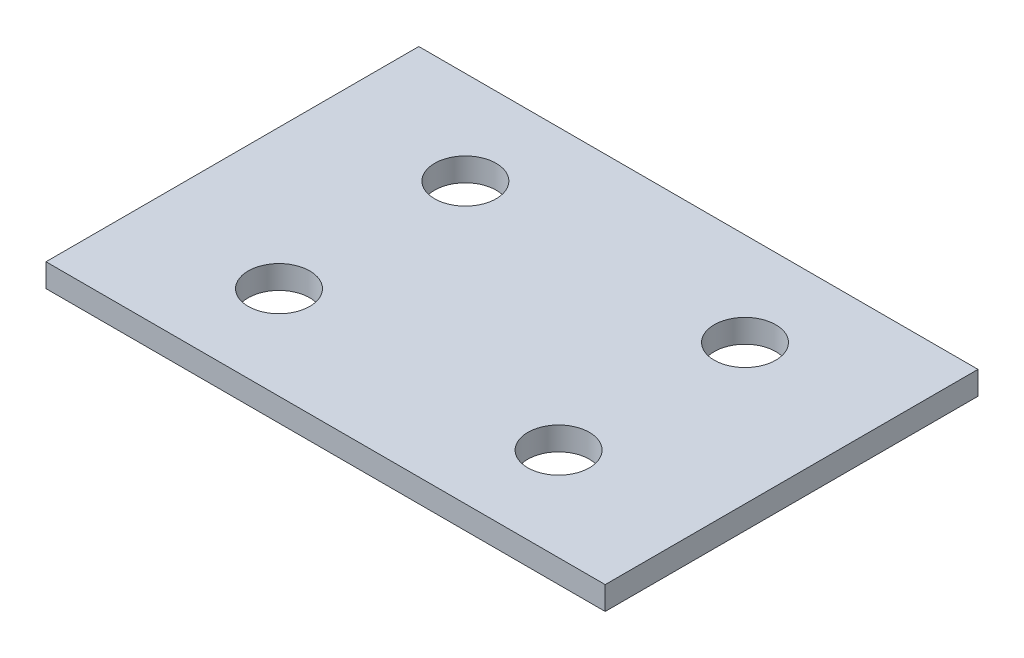
ISO-10303-21;
HEADER;
FILE_DESCRIPTION(('STEP AP214'),'2;1');
FILE_NAME('part.step','',(''),(''),'','','');
FILE_SCHEMA(('AUTOMOTIVE_DESIGN { 1 0 10303 214 1 1 1 1 }'));
ENDSEC;
DATA;
#1=APPLICATION_CONTEXT('core data for automotive mechanical design processes');
#2=APPLICATION_PROTOCOL_DEFINITION('international standard','automotive_design',2000,#1);
#3=PRODUCT_CONTEXT('',#1,'mechanical');
#4=PRODUCT('Part','Part','',(#3));
#5=PRODUCT_RELATED_PRODUCT_CATEGORY('part','',(#4));
#6=PRODUCT_DEFINITION_FORMATION('','',#4);
#7=PRODUCT_DEFINITION_CONTEXT('part definition',#1,'design');
#8=PRODUCT_DEFINITION('design','',#6,#7);
#9=PRODUCT_DEFINITION_SHAPE('','',#8);
#10=(LENGTH_UNIT() NAMED_UNIT(*) SI_UNIT(.MILLI.,.METRE.));
#11=(NAMED_UNIT(*) PLANE_ANGLE_UNIT() SI_UNIT($,.RADIAN.));
#12=(NAMED_UNIT(*) SI_UNIT($,.STERADIAN.) SOLID_ANGLE_UNIT());
#13=UNCERTAINTY_MEASURE_WITH_UNIT(LENGTH_MEASURE(1.E-05),#10,'distance_accuracy_value','');
#14=(GEOMETRIC_REPRESENTATION_CONTEXT(3) GLOBAL_UNCERTAINTY_ASSIGNED_CONTEXT((#13)) GLOBAL_UNIT_ASSIGNED_CONTEXT((#10,
#11,#12)) REPRESENTATION_CONTEXT('',''));
#15=CARTESIAN_POINT('',(0.,0.,0.));
#16=DIRECTION('',(0.,0.,1.));
#17=DIRECTION('',(1.,0.,0.));
#18=AXIS2_PLACEMENT_3D('',#15,#16,#17);
#19=CARTESIAN_POINT('',(0.,3.175,0.));
#20=DIRECTION('',(1.,0.,0.));
#21=DIRECTION('',(0.,0.,-1.));
#22=AXIS2_PLACEMENT_3D('',#19,#20,#21);
#23=PLANE('',#22);
#24=DIRECTION('',(0.,0.,1.));
#25=VECTOR('',#24,1.);
#26=CARTESIAN_POINT('',(0.,0.,0.));
#27=LINE('',#26,#25);
#28=CARTESIAN_POINT('',(0.,0.,-50.8));
#29=VERTEX_POINT('',#28);
#30=CARTESIAN_POINT('',(0.,0.,0.));
#31=VERTEX_POINT('',#30);
#32=EDGE_CURVE('E100',#29,#31,#27,.T.);
#33=ORIENTED_EDGE('',*,*,#32,.T.);
#34=DIRECTION('',(0.,-1.,0.));
#35=VECTOR('',#34,1.);
#36=CARTESIAN_POINT('',(0.,3.175,0.));
#37=LINE('',#36,#35);
#38=CARTESIAN_POINT('',(0.,3.175,0.));
#39=VERTEX_POINT('',#38);
#40=EDGE_CURVE('E11',#39,#31,#37,.T.);
#41=ORIENTED_EDGE('',*,*,#40,.F.);
#42=DIRECTION('',(0.,0.,1.));
#43=VECTOR('',#42,1.);
#44=CARTESIAN_POINT('',(0.,3.175,0.));
#45=LINE('',#44,#43);
#46=CARTESIAN_POINT('',(0.,3.175,-50.8));
#47=VERTEX_POINT('',#46);
#48=EDGE_CURVE('E88',#47,#39,#45,.T.);
#49=ORIENTED_EDGE('',*,*,#48,.F.);
#50=DIRECTION('',(0.,-1.,0.));
#51=VECTOR('',#50,1.);
#52=CARTESIAN_POINT('',(0.,3.175,-50.8));
#53=LINE('',#52,#51);
#54=EDGE_CURVE('E96',#47,#29,#53,.T.);
#55=ORIENTED_EDGE('',*,*,#54,.T.);
#56=EDGE_LOOP('',(#33,#41,#49,#55));
#57=FACE_BOUND('',#56,.T.);
#58=ADVANCED_FACE('F37',(#57),#23,.F.);
#59=CARTESIAN_POINT('',(0.,3.175,0.));
#60=DIRECTION('',(0.,0.,-1.));
#61=DIRECTION('',(-1.,0.,0.));
#62=AXIS2_PLACEMENT_3D('',#59,#60,#61);
#63=PLANE('',#62);
#64=DIRECTION('',(1.,0.,0.));
#65=VECTOR('',#64,1.);
#66=CARTESIAN_POINT('',(0.,0.,0.));
#67=LINE('',#66,#65);
#68=CARTESIAN_POINT('',(76.2,0.,0.));
#69=VERTEX_POINT('',#68);
#70=EDGE_CURVE('E92',#31,#69,#67,.T.);
#71=ORIENTED_EDGE('',*,*,#70,.T.);
#72=DIRECTION('',(0.,-1.,0.));
#73=VECTOR('',#72,1.);
#74=CARTESIAN_POINT('',(76.2,3.175,0.));
#75=LINE('',#74,#73);
#76=CARTESIAN_POINT('',(76.2,3.175,0.));
#77=VERTEX_POINT('',#76);
#78=EDGE_CURVE('E45',#77,#69,#75,.T.);
#79=ORIENTED_EDGE('',*,*,#78,.F.);
#80=DIRECTION('',(1.,0.,0.));
#81=VECTOR('',#80,1.);
#82=CARTESIAN_POINT('',(0.,3.175,0.));
#83=LINE('',#82,#81);
#84=EDGE_CURVE('E83',#39,#77,#83,.T.);
#85=ORIENTED_EDGE('',*,*,#84,.F.);
#86=ORIENTED_EDGE('',*,*,#40,.T.);
#87=EDGE_LOOP('',(#71,#79,#85,#86));
#88=FACE_BOUND('',#87,.T.);
#89=ADVANCED_FACE('F91',(#88),#63,.F.);
#90=CARTESIAN_POINT('',(76.2,3.175,0.));
#91=DIRECTION('',(-1.,0.,0.));
#92=DIRECTION('',(0.,0.,1.));
#93=AXIS2_PLACEMENT_3D('',#90,#91,#92);
#94=PLANE('',#93);
#95=DIRECTION('',(0.,0.,-1.));
#96=VECTOR('',#95,1.);
#97=CARTESIAN_POINT('',(76.2,0.,0.));
#98=LINE('',#97,#96);
#99=CARTESIAN_POINT('',(76.2,0.,-50.8));
#100=VERTEX_POINT('',#99);
#101=EDGE_CURVE('E70',#69,#100,#98,.T.);
#102=ORIENTED_EDGE('',*,*,#101,.T.);
#103=DIRECTION('',(0.,-1.,0.));
#104=VECTOR('',#103,1.);
#105=CARTESIAN_POINT('',(76.2,3.175,-50.8));
#106=LINE('',#105,#104);
#107=CARTESIAN_POINT('',(76.2,3.175,-50.8));
#108=VERTEX_POINT('',#107);
#109=EDGE_CURVE('E93',#108,#100,#106,.T.);
#110=ORIENTED_EDGE('',*,*,#109,.F.);
#111=DIRECTION('',(0.,0.,-1.));
#112=VECTOR('',#111,1.);
#113=CARTESIAN_POINT('',(76.2,3.175,0.));
#114=LINE('',#113,#112);
#115=EDGE_CURVE('E86',#77,#108,#114,.T.);
#116=ORIENTED_EDGE('',*,*,#115,.F.);
#117=ORIENTED_EDGE('',*,*,#78,.T.);
#118=EDGE_LOOP('',(#102,#110,#116,#117));
#119=FACE_BOUND('',#118,.T.);
#120=ADVANCED_FACE('F94',(#119),#94,.F.);
#121=CARTESIAN_POINT('',(0.,3.175,-50.8));
#122=DIRECTION('',(0.,0.,1.));
#123=DIRECTION('',(1.,0.,0.));
#124=AXIS2_PLACEMENT_3D('',#121,#122,#123);
#125=PLANE('',#124);
#126=DIRECTION('',(-1.,0.,0.));
#127=VECTOR('',#126,1.);
#128=CARTESIAN_POINT('',(0.,0.,-50.8));
#129=LINE('',#128,#127);
#130=EDGE_CURVE('E76',#100,#29,#129,.T.);
#131=ORIENTED_EDGE('',*,*,#130,.T.);
#132=ORIENTED_EDGE('',*,*,#54,.F.);
#133=DIRECTION('',(-1.,0.,0.));
#134=VECTOR('',#133,1.);
#135=CARTESIAN_POINT('',(0.,3.175,-50.8));
#136=LINE('',#135,#134);
#137=EDGE_CURVE('E53',#108,#47,#136,.T.);
#138=ORIENTED_EDGE('',*,*,#137,.F.);
#139=ORIENTED_EDGE('',*,*,#109,.T.);
#140=EDGE_LOOP('',(#131,#132,#138,#139));
#141=FACE_BOUND('',#140,.T.);
#142=ADVANCED_FACE('F108',(#141),#125,.F.);
#143=CARTESIAN_POINT('',(0.,3.175,0.));
#144=DIRECTION('',(0.,-1.,0.));
#145=DIRECTION('',(0.,0.,-1.));
#146=AXIS2_PLACEMENT_3D('',#143,#144,#145);
#147=PLANE('',#146);
#148=CARTESIAN_POINT('',(19.05,3.175,-12.7));
#149=DIRECTION('',(0.,1.,0.));
#150=DIRECTION('',(0.,0.,1.));
#151=AXIS2_PLACEMENT_3D('',#148,#149,#150);
#152=CIRCLE('',#151,4.191);
#153=CARTESIAN_POINT('',(19.05,3.175,-8.509));
#154=VERTEX_POINT('',#153);
#155=EDGE_CURVE('E117',#154,#154,#152,.T.);
#156=ORIENTED_EDGE('',*,*,#155,.F.);
#157=EDGE_LOOP('',(#156));
#158=FACE_BOUND('',#157,.T.);
#159=CARTESIAN_POINT('',(57.15,3.175,-38.1));
#160=DIRECTION('',(0.,1.,0.));
#161=DIRECTION('',(0.,0.,1.));
#162=AXIS2_PLACEMENT_3D('',#159,#160,#161);
#163=CIRCLE('',#162,4.191);
#164=CARTESIAN_POINT('',(57.15,3.175,-33.909));
#165=VERTEX_POINT('',#164);
#166=EDGE_CURVE('E123',#165,#165,#163,.T.);
#167=ORIENTED_EDGE('',*,*,#166,.F.);
#168=EDGE_LOOP('',(#167));
#169=FACE_BOUND('',#168,.T.);
#170=CARTESIAN_POINT('',(57.15,3.175,-12.7));
#171=DIRECTION('',(0.,1.,0.));
#172=DIRECTION('',(0.,0.,1.));
#173=AXIS2_PLACEMENT_3D('',#170,#171,#172);
#174=CIRCLE('',#173,4.191);
#175=CARTESIAN_POINT('',(57.15,3.175,-8.509));
#176=VERTEX_POINT('',#175);
#177=EDGE_CURVE('E124',#176,#176,#174,.T.);
#178=ORIENTED_EDGE('',*,*,#177,.F.);
#179=EDGE_LOOP('',(#178));
#180=FACE_BOUND('',#179,.T.);
#181=CARTESIAN_POINT('',(19.05,3.175,-38.1));
#182=DIRECTION('',(0.,1.,0.));
#183=DIRECTION('',(0.,0.,1.));
#184=AXIS2_PLACEMENT_3D('',#181,#182,#183);
#185=CIRCLE('',#184,4.191);
#186=CARTESIAN_POINT('',(19.05,3.175,-33.909));
#187=VERTEX_POINT('',#186);
#188=EDGE_CURVE('E114',#187,#187,#185,.T.);
#189=ORIENTED_EDGE('',*,*,#188,.F.);
#190=EDGE_LOOP('',(#189));
#191=FACE_BOUND('',#190,.T.);
#192=ORIENTED_EDGE('',*,*,#48,.T.);
#193=ORIENTED_EDGE('',*,*,#84,.T.);
#194=ORIENTED_EDGE('',*,*,#115,.T.);
#195=ORIENTED_EDGE('',*,*,#137,.T.);
#196=EDGE_LOOP('',(#192,#193,#194,#195));
#197=FACE_BOUND('',#196,.T.);
#198=ADVANCED_FACE('F84',(#158,#169,#180,#191,#197),#147,.F.);
#199=CARTESIAN_POINT('',(0.,0.,0.));
#200=DIRECTION('',(0.,-1.,0.));
#201=DIRECTION('',(0.,0.,-1.));
#202=AXIS2_PLACEMENT_3D('',#199,#200,#201);
#203=PLANE('',#202);
#204=CARTESIAN_POINT('',(19.05,0.,-12.7));
#205=DIRECTION('',(0.,1.,0.));
#206=DIRECTION('',(0.,0.,1.));
#207=AXIS2_PLACEMENT_3D('',#204,#205,#206);
#208=CIRCLE('',#207,4.191);
#209=CARTESIAN_POINT('',(19.05,0.,-8.509));
#210=VERTEX_POINT('',#209);
#211=EDGE_CURVE('E127',#210,#210,#208,.T.);
#212=ORIENTED_EDGE('',*,*,#211,.T.);
#213=EDGE_LOOP('',(#212));
#214=FACE_BOUND('',#213,.T.);
#215=CARTESIAN_POINT('',(57.15,0.,-38.1));
#216=DIRECTION('',(0.,1.,0.));
#217=DIRECTION('',(0.,0.,1.));
#218=AXIS2_PLACEMENT_3D('',#215,#216,#217);
#219=CIRCLE('',#218,4.191);
#220=CARTESIAN_POINT('',(57.15,0.,-33.909));
#221=VERTEX_POINT('',#220);
#222=EDGE_CURVE('E120',#221,#221,#219,.T.);
#223=ORIENTED_EDGE('',*,*,#222,.T.);
#224=EDGE_LOOP('',(#223));
#225=FACE_BOUND('',#224,.T.);
#226=CARTESIAN_POINT('',(57.15,0.,-12.7));
#227=DIRECTION('',(0.,1.,0.));
#228=DIRECTION('',(0.,0.,1.));
#229=AXIS2_PLACEMENT_3D('',#226,#227,#228);
#230=CIRCLE('',#229,4.191);
#231=CARTESIAN_POINT('',(57.15,0.,-8.509));
#232=VERTEX_POINT('',#231);
#233=EDGE_CURVE('E132',#232,#232,#230,.T.);
#234=ORIENTED_EDGE('',*,*,#233,.T.);
#235=EDGE_LOOP('',(#234));
#236=FACE_BOUND('',#235,.T.);
#237=CARTESIAN_POINT('',(19.05,0.,-38.1));
#238=DIRECTION('',(0.,1.,0.));
#239=DIRECTION('',(0.,0.,1.));
#240=AXIS2_PLACEMENT_3D('',#237,#238,#239);
#241=CIRCLE('',#240,4.191);
#242=CARTESIAN_POINT('',(19.05,0.,-33.909));
#243=VERTEX_POINT('',#242);
#244=EDGE_CURVE('E103',#243,#243,#241,.T.);
#245=ORIENTED_EDGE('',*,*,#244,.T.);
#246=EDGE_LOOP('',(#245));
#247=FACE_BOUND('',#246,.T.);
#248=ORIENTED_EDGE('',*,*,#32,.F.);
#249=ORIENTED_EDGE('',*,*,#130,.F.);
#250=ORIENTED_EDGE('',*,*,#101,.F.);
#251=ORIENTED_EDGE('',*,*,#70,.F.);
#252=EDGE_LOOP('',(#248,#249,#250,#251));
#253=FACE_BOUND('',#252,.T.);
#254=ADVANCED_FACE('F111',(#214,#225,#236,#247,#253),#203,.T.);
#255=CARTESIAN_POINT('',(19.05,0.,-38.1));
#256=DIRECTION('',(0.,1.,0.));
#257=DIRECTION('',(0.,0.,1.));
#258=AXIS2_PLACEMENT_3D('',#255,#256,#257);
#259=CYLINDRICAL_SURFACE('',#258,4.191);
#260=ORIENTED_EDGE('',*,*,#244,.F.);
#261=EDGE_LOOP('',(#260));
#262=FACE_BOUND('',#261,.T.);
#263=ORIENTED_EDGE('',*,*,#188,.T.);
#264=EDGE_LOOP('',(#263));
#265=FACE_BOUND('',#264,.T.);
#266=ADVANCED_FACE('F146',(#262,#265),#259,.F.);
#267=CARTESIAN_POINT('',(57.15,0.,-12.7));
#268=DIRECTION('',(0.,1.,0.));
#269=DIRECTION('',(0.,0.,1.));
#270=AXIS2_PLACEMENT_3D('',#267,#268,#269);
#271=CYLINDRICAL_SURFACE('',#270,4.191);
#272=ORIENTED_EDGE('',*,*,#233,.F.);
#273=EDGE_LOOP('',(#272));
#274=FACE_BOUND('',#273,.T.);
#275=ORIENTED_EDGE('',*,*,#177,.T.);
#276=EDGE_LOOP('',(#275));
#277=FACE_BOUND('',#276,.T.);
#278=ADVANCED_FACE('F138',(#274,#277),#271,.F.);
#279=CARTESIAN_POINT('',(57.15,0.,-38.1));
#280=DIRECTION('',(0.,1.,0.));
#281=DIRECTION('',(0.,0.,1.));
#282=AXIS2_PLACEMENT_3D('',#279,#280,#281);
#283=CYLINDRICAL_SURFACE('',#282,4.191);
#284=ORIENTED_EDGE('',*,*,#222,.F.);
#285=EDGE_LOOP('',(#284));
#286=FACE_BOUND('',#285,.T.);
#287=ORIENTED_EDGE('',*,*,#166,.T.);
#288=EDGE_LOOP('',(#287));
#289=FACE_BOUND('',#288,.T.);
#290=ADVANCED_FACE('F154',(#286,#289),#283,.F.);
#291=CARTESIAN_POINT('',(19.05,0.,-12.7));
#292=DIRECTION('',(0.,1.,0.));
#293=DIRECTION('',(0.,0.,1.));
#294=AXIS2_PLACEMENT_3D('',#291,#292,#293);
#295=CYLINDRICAL_SURFACE('',#294,4.191);
#296=ORIENTED_EDGE('',*,*,#211,.F.);
#297=EDGE_LOOP('',(#296));
#298=FACE_BOUND('',#297,.T.);
#299=ORIENTED_EDGE('',*,*,#155,.T.);
#300=EDGE_LOOP('',(#299));
#301=FACE_BOUND('',#300,.T.);
#302=ADVANCED_FACE('F208',(#298,#301),#295,.F.);
#303=CLOSED_SHELL('',(#58,#89,#120,#142,#198,#254,#266,#278,#290,#302));
#304=MANIFOLD_SOLID_BREP('B2',#303);
#305=ADVANCED_BREP_SHAPE_REPRESENTATION('',(#18,#304),#14);
#306=SHAPE_DEFINITION_REPRESENTATION(#9,#305);
ENDSEC;
END-ISO-10303-21;
